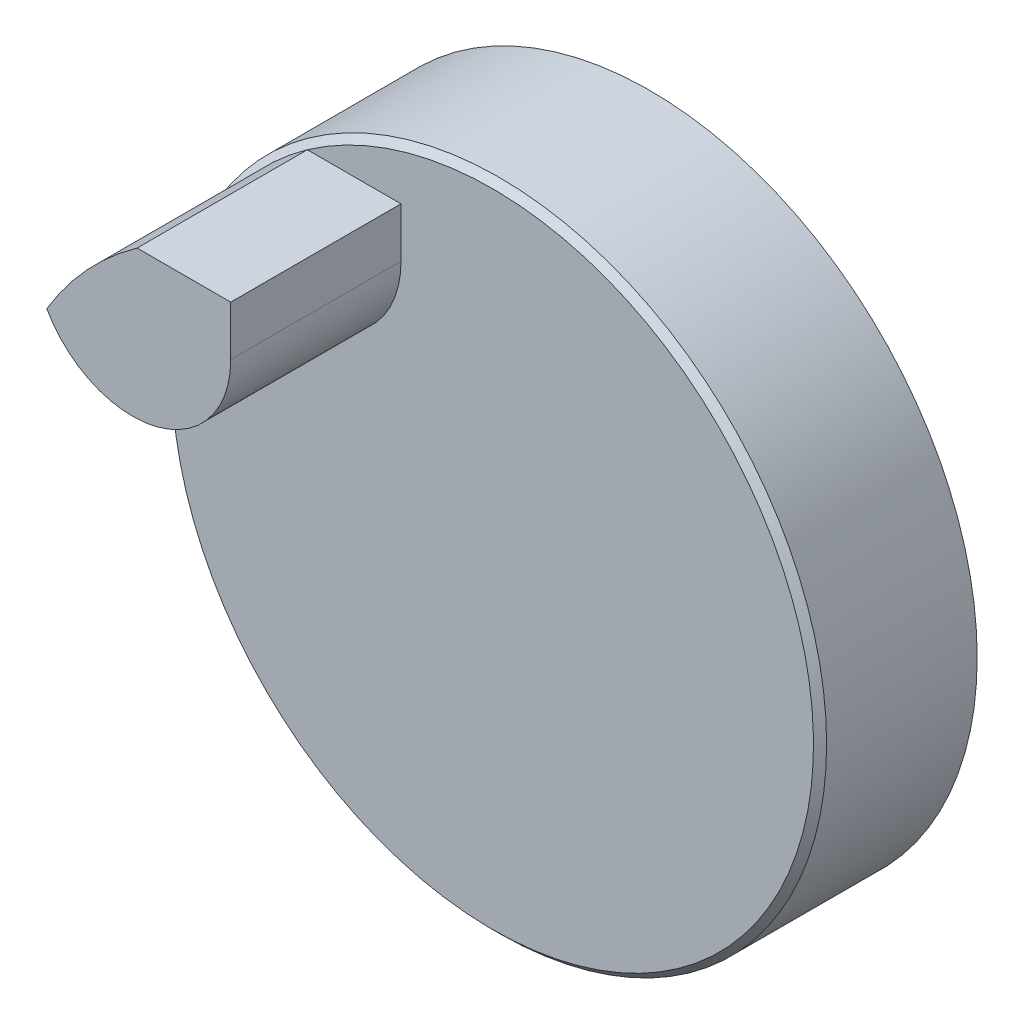
ISO-10303-21;
HEADER;
FILE_DESCRIPTION(('STEP AP214'),'2;1');
FILE_NAME('part.step','',(''),(''),'','','');
FILE_SCHEMA(('AUTOMOTIVE_DESIGN { 1 0 10303 214 1 1 1 1 }'));
ENDSEC;
DATA;
#1=APPLICATION_CONTEXT('core data for automotive mechanical design processes');
#2=APPLICATION_PROTOCOL_DEFINITION('international standard','automotive_design',2000,#1);
#3=PRODUCT_CONTEXT('',#1,'mechanical');
#4=PRODUCT('Part','Part','',(#3));
#5=PRODUCT_RELATED_PRODUCT_CATEGORY('part','',(#4));
#6=PRODUCT_DEFINITION_FORMATION('','',#4);
#7=PRODUCT_DEFINITION_CONTEXT('part definition',#1,'design');
#8=PRODUCT_DEFINITION('design','',#6,#7);
#9=PRODUCT_DEFINITION_SHAPE('','',#8);
#10=(LENGTH_UNIT() NAMED_UNIT(*) SI_UNIT(.MILLI.,.METRE.));
#11=(NAMED_UNIT(*) PLANE_ANGLE_UNIT() SI_UNIT($,.RADIAN.));
#12=(NAMED_UNIT(*) SI_UNIT($,.STERADIAN.) SOLID_ANGLE_UNIT());
#13=UNCERTAINTY_MEASURE_WITH_UNIT(LENGTH_MEASURE(1.E-05),#10,'distance_accuracy_value','');
#14=(GEOMETRIC_REPRESENTATION_CONTEXT(3) GLOBAL_UNCERTAINTY_ASSIGNED_CONTEXT((#13)) GLOBAL_UNIT_ASSIGNED_CONTEXT((#10,
#11,#12)) REPRESENTATION_CONTEXT('',''));
#15=CARTESIAN_POINT('',(0.,0.,0.));
#16=DIRECTION('',(0.,0.,1.));
#17=DIRECTION('',(1.,0.,0.));
#18=AXIS2_PLACEMENT_3D('',#15,#16,#17);
#19=CARTESIAN_POINT('',(0.,0.,12.));
#20=DIRECTION('',(0.,0.,-1.));
#21=DIRECTION('',(-1.,0.,0.));
#22=AXIS2_PLACEMENT_3D('',#19,#20,#21);
#23=CYLINDRICAL_SURFACE('',#22,25.);
#24=CARTESIAN_POINT('',(0.,0.,11.5));
#25=DIRECTION('',(0.,0.,1.));
#26=DIRECTION('',(1.,0.,0.));
#27=AXIS2_PLACEMENT_3D('',#24,#25,#26);
#28=CIRCLE('',#27,25.);
#29=CARTESIAN_POINT('',(25.,0.,11.5));
#30=VERTEX_POINT('',#29);
#31=EDGE_CURVE('E11',#30,#30,#28,.F.);
#32=ORIENTED_EDGE('',*,*,#31,.T.);
#33=EDGE_LOOP('',(#32));
#34=FACE_BOUND('',#33,.T.);
#35=CARTESIAN_POINT('',(0.,0.,0.));
#36=DIRECTION('',(0.,0.,1.));
#37=DIRECTION('',(1.,0.,0.));
#38=AXIS2_PLACEMENT_3D('',#35,#36,#37);
#39=CIRCLE('',#38,25.);
#40=CARTESIAN_POINT('',(25.,0.,0.));
#41=VERTEX_POINT('',#40);
#42=EDGE_CURVE('E121',#41,#41,#39,.T.);
#43=ORIENTED_EDGE('',*,*,#42,.T.);
#44=EDGE_LOOP('',(#43));
#45=FACE_BOUND('',#44,.T.);
#46=ADVANCED_FACE('F43',(#34,#45),#23,.T.);
#47=CARTESIAN_POINT('',(0.,0.,12.));
#48=DIRECTION('',(0.,0.,1.));
#49=DIRECTION('',(1.,0.,0.));
#50=AXIS2_PLACEMENT_3D('',#47,#48,#49);
#51=PLANE('',#50);
#52=CARTESIAN_POINT('',(-14.5,16.2,12.));
#53=DIRECTION('',(0.,0.,1.));
#54=DIRECTION('',(1.,0.,0.));
#55=AXIS2_PLACEMENT_3D('',#52,#53,#54);
#56=CIRCLE('',#55,7.5);
#57=CARTESIAN_POINT('',(-21.0469080526276,12.5410390886975,12.));
#58=VERTEX_POINT('',#57);
#59=CARTESIAN_POINT('',(-7.,16.2,12.));
#60=VERTEX_POINT('',#59);
#61=EDGE_CURVE('E109',#58,#60,#56,.T.);
#62=ORIENTED_EDGE('',*,*,#61,.F.);
#63=CARTESIAN_POINT('',(0.,0.,12.));
#64=DIRECTION('',(0.,0.,1.));
#65=DIRECTION('',(1.,0.,0.));
#66=AXIS2_PLACEMENT_3D('',#63,#64,#65);
#67=CIRCLE('',#66,24.5);
#68=CARTESIAN_POINT('',(-14.1509716980849,20.,12.));
#69=VERTEX_POINT('',#68);
#70=EDGE_CURVE('E123',#58,#69,#67,.T.);
#71=ORIENTED_EDGE('',*,*,#70,.T.);
#72=DIRECTION('',(1.,0.,0.));
#73=VECTOR('',#72,1.);
#74=CARTESIAN_POINT('',(0.,20.,12.));
#75=LINE('',#74,#73);
#76=CARTESIAN_POINT('',(-7.,20.,12.));
#77=VERTEX_POINT('',#76);
#78=EDGE_CURVE('E96',#69,#77,#75,.T.);
#79=ORIENTED_EDGE('',*,*,#78,.T.);
#80=DIRECTION('',(0.,-1.,0.));
#81=VECTOR('',#80,1.);
#82=CARTESIAN_POINT('',(-7.,0.,12.));
#83=LINE('',#82,#81);
#84=EDGE_CURVE('E59',#77,#60,#83,.T.);
#85=ORIENTED_EDGE('',*,*,#84,.T.);
#86=EDGE_LOOP('',(#62,#71,#79,#85));
#87=FACE_BOUND('',#86,.T.);
#88=ADVANCED_FACE('F128',(#87),#51,.T.);
#89=CARTESIAN_POINT('',(0.,0.,0.));
#90=DIRECTION('',(0.,0.,1.));
#91=DIRECTION('',(1.,0.,0.));
#92=AXIS2_PLACEMENT_3D('',#89,#90,#91);
#93=PLANE('',#92);
#94=CARTESIAN_POINT('',(16.6434890351651,5.40779740156177,0.));
#95=DIRECTION('',(0.,0.,-1.));
#96=DIRECTION('',(-0.309016994374958,0.95105651629515,0.));
#97=AXIS2_PLACEMENT_3D('',#94,#95,#96);
#98=CIRCLE('',#97,4.25);
#99=CARTESIAN_POINT('',(15.3301668090716,9.44978759581616,0.));
#100=VERTEX_POINT('',#99);
#101=EDGE_CURVE('E222',#100,#100,#98,.T.);
#102=ORIENTED_EDGE('',*,*,#101,.F.);
#103=EDGE_LOOP('',(#102));
#104=FACE_BOUND('',#103,.T.);
#105=CARTESIAN_POINT('',(10.2862419151184,-14.1577974015615,0.));
#106=DIRECTION('',(0.,0.,-1.));
#107=DIRECTION('',(0.809016994374942,0.58778525229248,0.));
#108=AXIS2_PLACEMENT_3D('',#105,#106,#107);
#109=CIRCLE('',#108,4.25);
#110=CARTESIAN_POINT('',(13.7245641412119,-11.6597100793184,0.));
#111=VERTEX_POINT('',#110);
#112=EDGE_CURVE('E216',#111,#111,#109,.T.);
#113=ORIENTED_EDGE('',*,*,#112,.F.);
#114=EDGE_LOOP('',(#113));
#115=FACE_BOUND('',#114,.T.);
#116=CARTESIAN_POINT('',(-10.2862419151182,-14.1577974015616,0.));
#117=DIRECTION('',(0.,0.,-1.));
#118=DIRECTION('',(0.809016994374951,-0.587785252292469,0.));
#119=AXIS2_PLACEMENT_3D('',#116,#117,#118);
#120=CIRCLE('',#119,4.25);
#121=CARTESIAN_POINT('',(-6.84791968902466,-16.6558847238046,0.));
#122=VERTEX_POINT('',#121);
#123=EDGE_CURVE('E205',#122,#122,#120,.T.);
#124=ORIENTED_EDGE('',*,*,#123,.F.);
#125=EDGE_LOOP('',(#124));
#126=FACE_BOUND('',#125,.T.);
#127=CARTESIAN_POINT('',(-16.6434890351652,5.40779740156153,0.));
#128=DIRECTION('',(0.,0.,-1.));
#129=DIRECTION('',(-0.309016994374945,-0.951056516295155,0.));
#130=AXIS2_PLACEMENT_3D('',#127,#128,#129);
#131=CIRCLE('',#130,4.25);
#132=CARTESIAN_POINT('',(-17.9568112612587,1.36580720730713,0.));
#133=VERTEX_POINT('',#132);
#134=EDGE_CURVE('E204',#133,#133,#131,.T.);
#135=ORIENTED_EDGE('',*,*,#134,.F.);
#136=EDGE_LOOP('',(#135));
#137=FACE_BOUND('',#136,.T.);
#138=CARTESIAN_POINT('',(0.,17.5,0.));
#139=DIRECTION('',(0.,0.,-1.));
#140=DIRECTION('',(-1.,0.,0.));
#141=AXIS2_PLACEMENT_3D('',#138,#139,#140);
#142=CIRCLE('',#141,4.25);
#143=CARTESIAN_POINT('',(-4.25,17.5,0.));
#144=VERTEX_POINT('',#143);
#145=EDGE_CURVE('E226',#144,#144,#142,.T.);
#146=ORIENTED_EDGE('',*,*,#145,.F.);
#147=EDGE_LOOP('',(#146));
#148=FACE_BOUND('',#147,.T.);
#149=ORIENTED_EDGE('',*,*,#42,.F.);
#150=EDGE_LOOP('',(#149));
#151=FACE_BOUND('',#150,.T.);
#152=ADVANCED_FACE('F132',(#104,#115,#126,#137,#148,#151),#93,.F.);
#153=CARTESIAN_POINT('',(0.,0.,12.));
#154=DIRECTION('',(0.,0.,-1.));
#155=DIRECTION('',(-1.,0.,0.));
#156=AXIS2_PLACEMENT_3D('',#153,#154,#155);
#157=CONICAL_SURFACE('',#156,24.5,0.785398163397445);
#158=ORIENTED_EDGE('',*,*,#31,.F.);
#159=EDGE_LOOP('',(#158));
#160=FACE_BOUND('',#159,.T.);
#161=EDGE_CURVE('E52',#69,#58,#67,.T.);
#162=ORIENTED_EDGE('',*,*,#161,.F.);
#163=ORIENTED_EDGE('',*,*,#70,.F.);
#164=EDGE_LOOP('',(#162,#163));
#165=FACE_BOUND('',#164,.T.);
#166=ADVANCED_FACE('F46',(#160,#165),#157,.T.);
#167=CARTESIAN_POINT('',(-7.,0.,25.));
#168=DIRECTION('',(1.,0.,0.));
#169=DIRECTION('',(0.,0.,-1.));
#170=AXIS2_PLACEMENT_3D('',#167,#168,#169);
#171=PLANE('',#170);
#172=ORIENTED_EDGE('',*,*,#84,.F.);
#173=DIRECTION('',(0.,0.,-1.));
#174=VECTOR('',#173,1.);
#175=CARTESIAN_POINT('',(-7.,20.,25.));
#176=LINE('',#175,#174);
#177=CARTESIAN_POINT('',(-7.,20.,25.));
#178=VERTEX_POINT('',#177);
#179=EDGE_CURVE('E85',#178,#77,#176,.T.);
#180=ORIENTED_EDGE('',*,*,#179,.F.);
#181=DIRECTION('',(0.,-1.,0.));
#182=VECTOR('',#181,1.);
#183=CARTESIAN_POINT('',(-7.,0.,25.));
#184=LINE('',#183,#182);
#185=CARTESIAN_POINT('',(-7.,16.2,25.));
#186=VERTEX_POINT('',#185);
#187=EDGE_CURVE('E107',#178,#186,#184,.T.);
#188=ORIENTED_EDGE('',*,*,#187,.T.);
#189=DIRECTION('',(0.,0.,-1.));
#190=VECTOR('',#189,1.);
#191=CARTESIAN_POINT('',(-7.,16.2,25.));
#192=LINE('',#191,#190);
#193=EDGE_CURVE('E82',#186,#60,#192,.T.);
#194=ORIENTED_EDGE('',*,*,#193,.T.);
#195=EDGE_LOOP('',(#172,#180,#188,#194));
#196=FACE_BOUND('',#195,.T.);
#197=ADVANCED_FACE('F131',(#196),#171,.T.);
#198=CARTESIAN_POINT('',(0.,20.,25.));
#199=DIRECTION('',(0.,1.,0.));
#200=DIRECTION('',(0.,0.,1.));
#201=AXIS2_PLACEMENT_3D('',#198,#199,#200);
#202=PLANE('',#201);
#203=ORIENTED_EDGE('',*,*,#78,.F.);
#204=DIRECTION('',(0.,0.,-1.));
#205=VECTOR('',#204,1.);
#206=CARTESIAN_POINT('',(-14.1509716980849,20.,25.));
#207=LINE('',#206,#205);
#208=CARTESIAN_POINT('',(-14.1509716980849,20.,25.));
#209=VERTEX_POINT('',#208);
#210=EDGE_CURVE('E90',#209,#69,#207,.T.);
#211=ORIENTED_EDGE('',*,*,#210,.F.);
#212=DIRECTION('',(1.,0.,0.));
#213=VECTOR('',#212,1.);
#214=CARTESIAN_POINT('',(0.,20.,25.));
#215=LINE('',#214,#213);
#216=EDGE_CURVE('E94',#209,#178,#215,.T.);
#217=ORIENTED_EDGE('',*,*,#216,.T.);
#218=ORIENTED_EDGE('',*,*,#179,.T.);
#219=EDGE_LOOP('',(#203,#211,#217,#218));
#220=FACE_BOUND('',#219,.T.);
#221=ADVANCED_FACE('F92',(#220),#202,.T.);
#222=CARTESIAN_POINT('',(0.,0.,25.));
#223=DIRECTION('',(0.,0.,-1.));
#224=DIRECTION('',(-1.,0.,0.));
#225=AXIS2_PLACEMENT_3D('',#222,#223,#224);
#226=CYLINDRICAL_SURFACE('',#225,24.5);
#227=ORIENTED_EDGE('',*,*,#161,.T.);
#228=DIRECTION('',(0.,0.,-1.));
#229=VECTOR('',#228,1.);
#230=CARTESIAN_POINT('',(-21.0469080526276,12.5410390886975,25.));
#231=LINE('',#230,#229);
#232=CARTESIAN_POINT('',(-21.0469080526276,12.5410390886975,25.));
#233=VERTEX_POINT('',#232);
#234=EDGE_CURVE('E99',#233,#58,#231,.T.);
#235=ORIENTED_EDGE('',*,*,#234,.F.);
#236=CARTESIAN_POINT('',(0.,0.,25.));
#237=DIRECTION('',(0.,0.,1.));
#238=DIRECTION('',(1.,0.,0.));
#239=AXIS2_PLACEMENT_3D('',#236,#237,#238);
#240=CIRCLE('',#239,24.5);
#241=EDGE_CURVE('E102',#209,#233,#240,.T.);
#242=ORIENTED_EDGE('',*,*,#241,.F.);
#243=ORIENTED_EDGE('',*,*,#210,.T.);
#244=EDGE_LOOP('',(#227,#235,#242,#243));
#245=FACE_BOUND('',#244,.T.);
#246=ADVANCED_FACE('F103',(#245),#226,.T.);
#247=CARTESIAN_POINT('',(-14.5,16.2,25.));
#248=DIRECTION('',(0.,0.,-1.));
#249=DIRECTION('',(-1.,0.,0.));
#250=AXIS2_PLACEMENT_3D('',#247,#248,#249);
#251=CYLINDRICAL_SURFACE('',#250,7.5);
#252=ORIENTED_EDGE('',*,*,#61,.T.);
#253=ORIENTED_EDGE('',*,*,#193,.F.);
#254=CARTESIAN_POINT('',(-14.5,16.2,25.));
#255=DIRECTION('',(0.,0.,1.));
#256=DIRECTION('',(1.,0.,0.));
#257=AXIS2_PLACEMENT_3D('',#254,#255,#256);
#258=CIRCLE('',#257,7.5);
#259=EDGE_CURVE('E68',#233,#186,#258,.T.);
#260=ORIENTED_EDGE('',*,*,#259,.F.);
#261=ORIENTED_EDGE('',*,*,#234,.T.);
#262=EDGE_LOOP('',(#252,#253,#260,#261));
#263=FACE_BOUND('',#262,.T.);
#264=ADVANCED_FACE('F154',(#263),#251,.T.);
#265=CARTESIAN_POINT('',(0.,0.,25.));
#266=DIRECTION('',(0.,0.,1.));
#267=DIRECTION('',(1.,0.,0.));
#268=AXIS2_PLACEMENT_3D('',#265,#266,#267);
#269=PLANE('',#268);
#270=ORIENTED_EDGE('',*,*,#187,.F.);
#271=ORIENTED_EDGE('',*,*,#216,.F.);
#272=ORIENTED_EDGE('',*,*,#241,.T.);
#273=ORIENTED_EDGE('',*,*,#259,.T.);
#274=EDGE_LOOP('',(#270,#271,#272,#273));
#275=FACE_BOUND('',#274,.T.);
#276=ADVANCED_FACE('F106',(#275),#269,.T.);
#277=CARTESIAN_POINT('',(0.,17.5,6.));
#278=DIRECTION('',(0.,0.,-1.));
#279=DIRECTION('',(-1.,0.,0.));
#280=AXIS2_PLACEMENT_3D('',#277,#278,#279);
#281=CYLINDRICAL_SURFACE('',#280,4.25);
#282=CARTESIAN_POINT('',(0.,17.5,6.));
#283=DIRECTION('',(0.,0.,-1.));
#284=DIRECTION('',(-1.,0.,0.));
#285=AXIS2_PLACEMENT_3D('',#282,#283,#284);
#286=CIRCLE('',#285,4.25);
#287=CARTESIAN_POINT('',(-4.25,17.5,6.));
#288=VERTEX_POINT('',#287);
#289=EDGE_CURVE('E115',#288,#288,#286,.T.);
#290=ORIENTED_EDGE('',*,*,#289,.F.);
#291=EDGE_LOOP('',(#290));
#292=FACE_BOUND('',#291,.T.);
#293=ORIENTED_EDGE('',*,*,#145,.T.);
#294=EDGE_LOOP('',(#293));
#295=FACE_BOUND('',#294,.T.);
#296=ADVANCED_FACE('F160',(#292,#295),#281,.F.);
#297=CARTESIAN_POINT('',(0.,17.5,6.));
#298=DIRECTION('',(0.,0.,-1.));
#299=DIRECTION('',(-1.,0.,0.));
#300=AXIS2_PLACEMENT_3D('',#297,#298,#299);
#301=PLANE('',#300);
#302=ORIENTED_EDGE('',*,*,#289,.T.);
#303=EDGE_LOOP('',(#302));
#304=FACE_BOUND('',#303,.T.);
#305=ADVANCED_FACE('F163',(#304),#301,.T.);
#306=CARTESIAN_POINT('',(-16.6434890351652,5.40779740156153,6.));
#307=DIRECTION('',(0.,0.,-1.));
#308=DIRECTION('',(-1.,0.,0.));
#309=AXIS2_PLACEMENT_3D('',#306,#307,#308);
#310=CYLINDRICAL_SURFACE('',#309,4.25);
#311=CARTESIAN_POINT('',(-16.6434890351652,5.40779740156153,6.));
#312=DIRECTION('',(0.,0.,-1.));
#313=DIRECTION('',(-0.309016994374945,-0.951056516295155,0.));
#314=AXIS2_PLACEMENT_3D('',#311,#312,#313);
#315=CIRCLE('',#314,4.25);
#316=CARTESIAN_POINT('',(-17.9568112612587,1.36580720730713,6.));
#317=VERTEX_POINT('',#316);
#318=EDGE_CURVE('E208',#317,#317,#315,.T.);
#319=ORIENTED_EDGE('',*,*,#318,.F.);
#320=EDGE_LOOP('',(#319));
#321=FACE_BOUND('',#320,.T.);
#322=ORIENTED_EDGE('',*,*,#134,.T.);
#323=EDGE_LOOP('',(#322));
#324=FACE_BOUND('',#323,.T.);
#325=ADVANCED_FACE('F167',(#321,#324),#310,.F.);
#326=CARTESIAN_POINT('',(-16.6434890351652,5.40779740156153,6.));
#327=DIRECTION('',(0.,0.,-1.));
#328=DIRECTION('',(-0.309016994374945,-0.951056516295155,0.));
#329=AXIS2_PLACEMENT_3D('',#326,#327,#328);
#330=PLANE('',#329);
#331=ORIENTED_EDGE('',*,*,#318,.T.);
#332=EDGE_LOOP('',(#331));
#333=FACE_BOUND('',#332,.T.);
#334=ADVANCED_FACE('F171',(#333),#330,.T.);
#335=CARTESIAN_POINT('',(-10.2862419151182,-14.1577974015616,6.));
#336=DIRECTION('',(0.,0.,-1.));
#337=DIRECTION('',(-1.,0.,0.));
#338=AXIS2_PLACEMENT_3D('',#335,#336,#337);
#339=CYLINDRICAL_SURFACE('',#338,4.25);
#340=CARTESIAN_POINT('',(-10.2862419151182,-14.1577974015616,6.));
#341=DIRECTION('',(0.,0.,-1.));
#342=DIRECTION('',(0.809016994374951,-0.587785252292469,0.));
#343=AXIS2_PLACEMENT_3D('',#340,#341,#342);
#344=CIRCLE('',#343,4.25);
#345=CARTESIAN_POINT('',(-6.84791968902466,-16.6558847238046,6.));
#346=VERTEX_POINT('',#345);
#347=EDGE_CURVE('E203',#346,#346,#344,.T.);
#348=ORIENTED_EDGE('',*,*,#347,.F.);
#349=EDGE_LOOP('',(#348));
#350=FACE_BOUND('',#349,.T.);
#351=ORIENTED_EDGE('',*,*,#123,.T.);
#352=EDGE_LOOP('',(#351));
#353=FACE_BOUND('',#352,.T.);
#354=ADVANCED_FACE('F175',(#350,#353),#339,.F.);
#355=CARTESIAN_POINT('',(-10.2862419151182,-14.1577974015616,6.));
#356=DIRECTION('',(0.,0.,-1.));
#357=DIRECTION('',(0.809016994374951,-0.587785252292469,0.));
#358=AXIS2_PLACEMENT_3D('',#355,#356,#357);
#359=PLANE('',#358);
#360=ORIENTED_EDGE('',*,*,#347,.T.);
#361=EDGE_LOOP('',(#360));
#362=FACE_BOUND('',#361,.T.);
#363=ADVANCED_FACE('F189',(#362),#359,.T.);
#364=CARTESIAN_POINT('',(10.2862419151184,-14.1577974015615,6.));
#365=DIRECTION('',(0.,0.,-1.));
#366=DIRECTION('',(-1.,0.,0.));
#367=AXIS2_PLACEMENT_3D('',#364,#365,#366);
#368=CYLINDRICAL_SURFACE('',#367,4.25);
#369=CARTESIAN_POINT('',(10.2862419151184,-14.1577974015615,6.));
#370=DIRECTION('',(0.,0.,-1.));
#371=DIRECTION('',(0.809016994374942,0.58778525229248,0.));
#372=AXIS2_PLACEMENT_3D('',#369,#370,#371);
#373=CIRCLE('',#372,4.25);
#374=CARTESIAN_POINT('',(13.7245641412119,-11.6597100793184,6.));
#375=VERTEX_POINT('',#374);
#376=EDGE_CURVE('E211',#375,#375,#373,.T.);
#377=ORIENTED_EDGE('',*,*,#376,.F.);
#378=EDGE_LOOP('',(#377));
#379=FACE_BOUND('',#378,.T.);
#380=ORIENTED_EDGE('',*,*,#112,.T.);
#381=EDGE_LOOP('',(#380));
#382=FACE_BOUND('',#381,.T.);
#383=ADVANCED_FACE('F186',(#379,#382),#368,.F.);
#384=CARTESIAN_POINT('',(10.2862419151184,-14.1577974015615,6.));
#385=DIRECTION('',(0.,0.,-1.));
#386=DIRECTION('',(0.809016994374942,0.58778525229248,0.));
#387=AXIS2_PLACEMENT_3D('',#384,#385,#386);
#388=PLANE('',#387);
#389=ORIENTED_EDGE('',*,*,#376,.T.);
#390=EDGE_LOOP('',(#389));
#391=FACE_BOUND('',#390,.T.);
#392=ADVANCED_FACE('F181',(#391),#388,.T.);
#393=CARTESIAN_POINT('',(16.6434890351651,5.40779740156177,6.));
#394=DIRECTION('',(0.,0.,-1.));
#395=DIRECTION('',(-1.,0.,0.));
#396=AXIS2_PLACEMENT_3D('',#393,#394,#395);
#397=CYLINDRICAL_SURFACE('',#396,4.25);
#398=CARTESIAN_POINT('',(16.6434890351651,5.40779740156177,6.));
#399=DIRECTION('',(0.,0.,-1.));
#400=DIRECTION('',(-0.309016994374958,0.95105651629515,0.));
#401=AXIS2_PLACEMENT_3D('',#398,#399,#400);
#402=CIRCLE('',#401,4.25);
#403=CARTESIAN_POINT('',(15.3301668090716,9.44978759581616,6.));
#404=VERTEX_POINT('',#403);
#405=EDGE_CURVE('E219',#404,#404,#402,.T.);
#406=ORIENTED_EDGE('',*,*,#405,.F.);
#407=EDGE_LOOP('',(#406));
#408=FACE_BOUND('',#407,.T.);
#409=ORIENTED_EDGE('',*,*,#101,.T.);
#410=EDGE_LOOP('',(#409));
#411=FACE_BOUND('',#410,.T.);
#412=ADVANCED_FACE('F177',(#408,#411),#397,.F.);
#413=CARTESIAN_POINT('',(16.6434890351651,5.40779740156177,6.));
#414=DIRECTION('',(0.,0.,-1.));
#415=DIRECTION('',(-0.309016994374958,0.95105651629515,0.));
#416=AXIS2_PLACEMENT_3D('',#413,#414,#415);
#417=PLANE('',#416);
#418=ORIENTED_EDGE('',*,*,#405,.T.);
#419=EDGE_LOOP('',(#418));
#420=FACE_BOUND('',#419,.T.);
#421=ADVANCED_FACE('F180',(#420),#417,.T.);
#422=CLOSED_SHELL('',(#46,#88,#152,#166,#197,#221,#246,#264,#276,#296,#305,#325,#334,#354,#363,
#383,#392,#412,#421));
#423=MANIFOLD_SOLID_BREP('B2',#422);
#424=ADVANCED_BREP_SHAPE_REPRESENTATION('',(#18,#423),#14);
#425=SHAPE_DEFINITION_REPRESENTATION(#9,#424);
ENDSEC;
END-ISO-10303-21;
